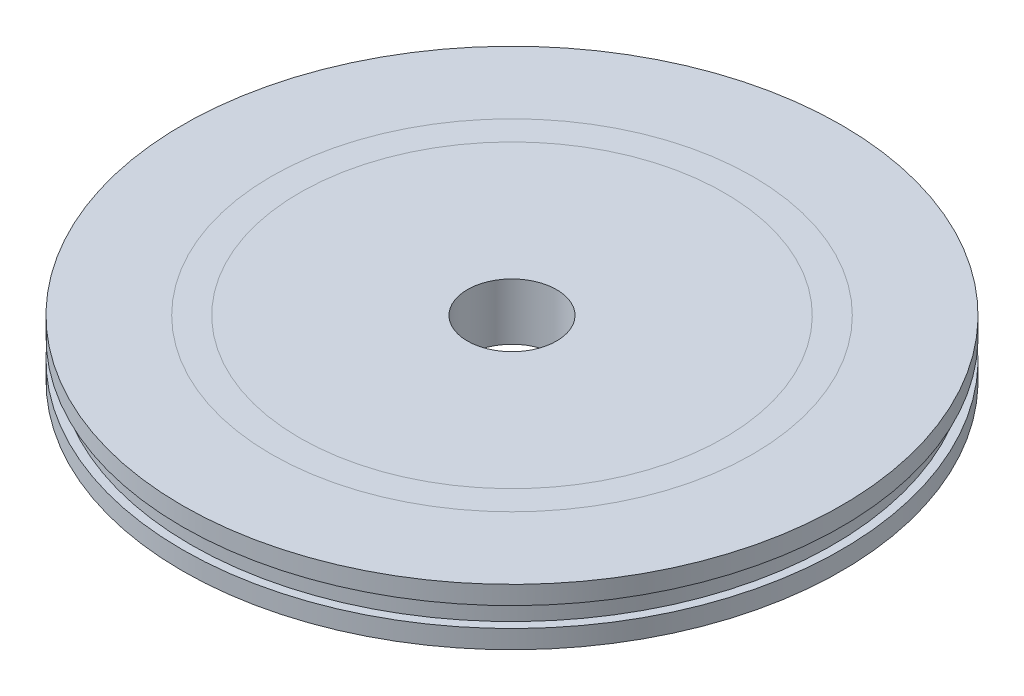
ISO-10303-21;
HEADER;
FILE_DESCRIPTION(('STEP AP214'),'2;1');
FILE_NAME('part.step','',(''),(''),'','','');
FILE_SCHEMA(('AUTOMOTIVE_DESIGN { 1 0 10303 214 1 1 1 1 }'));
ENDSEC;
DATA;
#1=APPLICATION_CONTEXT('core data for automotive mechanical design processes');
#2=APPLICATION_PROTOCOL_DEFINITION('international standard','automotive_design',2000,#1);
#3=PRODUCT_CONTEXT('',#1,'mechanical');
#4=PRODUCT('Part','Part','',(#3));
#5=PRODUCT_RELATED_PRODUCT_CATEGORY('part','',(#4));
#6=PRODUCT_DEFINITION_FORMATION('','',#4);
#7=PRODUCT_DEFINITION_CONTEXT('part definition',#1,'design');
#8=PRODUCT_DEFINITION('design','',#6,#7);
#9=PRODUCT_DEFINITION_SHAPE('','',#8);
#10=(LENGTH_UNIT() NAMED_UNIT(*) SI_UNIT(.MILLI.,.METRE.));
#11=(NAMED_UNIT(*) PLANE_ANGLE_UNIT() SI_UNIT($,.RADIAN.));
#12=(NAMED_UNIT(*) SI_UNIT($,.STERADIAN.) SOLID_ANGLE_UNIT());
#13=UNCERTAINTY_MEASURE_WITH_UNIT(LENGTH_MEASURE(1.E-05),#10,'distance_accuracy_value','');
#14=(GEOMETRIC_REPRESENTATION_CONTEXT(3) GLOBAL_UNCERTAINTY_ASSIGNED_CONTEXT((#13)) GLOBAL_UNIT_ASSIGNED_CONTEXT((#10,
#11,#12)) REPRESENTATION_CONTEXT('',''));
#15=CARTESIAN_POINT('',(0.,0.,0.));
#16=DIRECTION('',(0.,0.,1.));
#17=DIRECTION('',(1.,0.,0.));
#18=AXIS2_PLACEMENT_3D('',#15,#16,#17);
#19=CARTESIAN_POINT('',(0.,-5.08,0.));
#20=DIRECTION('',(0.,-1.,0.));
#21=DIRECTION('',(0.,0.,-1.));
#22=AXIS2_PLACEMENT_3D('',#19,#20,#21);
#23=PLANE('',#22);
#24=CARTESIAN_POINT('',(0.,-5.08,0.));
#25=DIRECTION('',(0.,1.,0.));
#26=DIRECTION('',(0.,0.,1.));
#27=AXIS2_PLACEMENT_3D('',#24,#25,#26);
#28=CIRCLE('',#27,29.5656);
#29=CARTESIAN_POINT('',(0.,-5.08,29.5656));
#30=VERTEX_POINT('',#29);
#31=EDGE_CURVE('E55',#30,#30,#28,.T.);
#32=ORIENTED_EDGE('',*,*,#31,.F.);
#33=EDGE_LOOP('',(#32));
#34=FACE_BOUND('',#33,.T.);
#35=CARTESIAN_POINT('',(0.,-5.08,0.));
#36=DIRECTION('',(0.,1.,0.));
#37=DIRECTION('',(0.,0.,1.));
#38=AXIS2_PLACEMENT_3D('',#35,#36,#37);
#39=CIRCLE('',#38,4.);
#40=CARTESIAN_POINT('',(0.,-5.08,4.));
#41=VERTEX_POINT('',#40);
#42=EDGE_CURVE('E83',#41,#41,#39,.T.);
#43=ORIENTED_EDGE('',*,*,#42,.T.);
#44=EDGE_LOOP('',(#43));
#45=FACE_BOUND('',#44,.T.);
#46=ADVANCED_FACE('F41',(#34,#45),#23,.T.);
#47=CARTESIAN_POINT('',(0.,0.,29.5656));
#48=DIRECTION('',(0.,1.,0.));
#49=DIRECTION('',(0.,0.,1.));
#50=AXIS2_PLACEMENT_3D('',#47,#48,#49);
#51=PLANE('',#50);
#52=CARTESIAN_POINT('',(0.,0.,0.));
#53=DIRECTION('',(0.,1.,0.));
#54=DIRECTION('',(0.,0.,1.));
#55=AXIS2_PLACEMENT_3D('',#52,#53,#54);
#56=CIRCLE('',#55,29.5656);
#57=CARTESIAN_POINT('',(0.,0.,29.5656));
#58=VERTEX_POINT('',#57);
#59=EDGE_CURVE('E79',#58,#58,#56,.T.);
#60=ORIENTED_EDGE('',*,*,#59,.T.);
#61=EDGE_LOOP('',(#60));
#62=FACE_BOUND('',#61,.T.);
#63=CARTESIAN_POINT('',(0.,0.,0.));
#64=DIRECTION('',(0.,1.,0.));
#65=DIRECTION('',(0.,0.,1.));
#66=AXIS2_PLACEMENT_3D('',#63,#64,#65);
#67=CIRCLE('',#66,21.59);
#68=CARTESIAN_POINT('',(0.,0.,21.59));
#69=VERTEX_POINT('',#68);
#70=EDGE_CURVE('E10',#69,#69,#67,.F.);
#71=ORIENTED_EDGE('',*,*,#70,.T.);
#72=EDGE_LOOP('',(#71));
#73=FACE_BOUND('',#72,.T.);
#74=ADVANCED_FACE('F98',(#62,#73),#51,.T.);
#75=ORIENTED_EDGE('',*,*,#70,.F.);
#76=EDGE_LOOP('',(#75));
#77=FACE_BOUND('',#76,.T.);
#78=CARTESIAN_POINT('',(0.,0.,0.));
#79=DIRECTION('',(0.,1.,0.));
#80=DIRECTION('',(0.,0.,1.));
#81=AXIS2_PLACEMENT_3D('',#78,#79,#80);
#82=CIRCLE('',#81,19.05);
#83=CARTESIAN_POINT('',(0.,0.,19.05));
#84=VERTEX_POINT('',#83);
#85=EDGE_CURVE('E49',#84,#84,#82,.F.);
#86=ORIENTED_EDGE('',*,*,#85,.T.);
#87=EDGE_LOOP('',(#86));
#88=FACE_BOUND('',#87,.T.);
#89=ADVANCED_FACE('F97',(#77,#88),#51,.T.);
#90=CARTESIAN_POINT('',(0.,0.,0.));
#91=DIRECTION('',(0.,1.,0.));
#92=DIRECTION('',(0.,0.,1.));
#93=AXIS2_PLACEMENT_3D('',#90,#91,#92);
#94=CIRCLE('',#93,4.);
#95=CARTESIAN_POINT('',(0.,0.,4.));
#96=VERTEX_POINT('',#95);
#97=EDGE_CURVE('E87',#96,#96,#94,.T.);
#98=ORIENTED_EDGE('',*,*,#97,.F.);
#99=EDGE_LOOP('',(#98));
#100=FACE_BOUND('',#99,.T.);
#101=ORIENTED_EDGE('',*,*,#85,.F.);
#102=EDGE_LOOP('',(#101));
#103=FACE_BOUND('',#102,.T.);
#104=ADVANCED_FACE('F43',(#100,#103),#51,.T.);
#105=CARTESIAN_POINT('',(0.,0.,0.));
#106=DIRECTION('',(0.,1.,0.));
#107=DIRECTION('',(0.,0.,1.));
#108=AXIS2_PLACEMENT_3D('',#105,#106,#107);
#109=CYLINDRICAL_SURFACE('',#108,29.5656);
#110=ORIENTED_EDGE('',*,*,#31,.T.);
#111=EDGE_LOOP('',(#110));
#112=FACE_BOUND('',#111,.T.);
#113=CARTESIAN_POINT('',(0.,-3.429,0.));
#114=DIRECTION('',(0.,1.,0.));
#115=DIRECTION('',(0.,0.,1.));
#116=AXIS2_PLACEMENT_3D('',#113,#114,#115);
#117=CIRCLE('',#116,29.5656);
#118=CARTESIAN_POINT('',(0.,-3.429,29.5656));
#119=VERTEX_POINT('',#118);
#120=EDGE_CURVE('E61',#119,#119,#117,.T.);
#121=ORIENTED_EDGE('',*,*,#120,.F.);
#122=EDGE_LOOP('',(#121));
#123=FACE_BOUND('',#122,.T.);
#124=ADVANCED_FACE('F96',(#112,#123),#109,.T.);
#125=CARTESIAN_POINT('',(0.,-3.429,29.5656));
#126=DIRECTION('',(0.,1.,0.));
#127=DIRECTION('',(0.,0.,1.));
#128=AXIS2_PLACEMENT_3D('',#125,#126,#127);
#129=PLANE('',#128);
#130=ORIENTED_EDGE('',*,*,#120,.T.);
#131=EDGE_LOOP('',(#130));
#132=FACE_BOUND('',#131,.T.);
#133=CARTESIAN_POINT('',(0.,-3.429,0.));
#134=DIRECTION('',(0.,1.,0.));
#135=DIRECTION('',(0.,0.,1.));
#136=AXIS2_PLACEMENT_3D('',#133,#134,#135);
#137=CIRCLE('',#136,28.8036);
#138=CARTESIAN_POINT('',(0.,-3.429,28.8036));
#139=VERTEX_POINT('',#138);
#140=EDGE_CURVE('E67',#139,#139,#137,.T.);
#141=ORIENTED_EDGE('',*,*,#140,.F.);
#142=EDGE_LOOP('',(#141));
#143=FACE_BOUND('',#142,.T.);
#144=ADVANCED_FACE('F103',(#132,#143),#129,.T.);
#145=CARTESIAN_POINT('',(0.,0.,0.));
#146=DIRECTION('',(0.,1.,0.));
#147=DIRECTION('',(0.,0.,1.));
#148=AXIS2_PLACEMENT_3D('',#145,#146,#147);
#149=CYLINDRICAL_SURFACE('',#148,28.8036);
#150=ORIENTED_EDGE('',*,*,#140,.T.);
#151=EDGE_LOOP('',(#150));
#152=FACE_BOUND('',#151,.T.);
#153=CARTESIAN_POINT('',(0.,-1.651,0.));
#154=DIRECTION('',(0.,1.,0.));
#155=DIRECTION('',(0.,0.,1.));
#156=AXIS2_PLACEMENT_3D('',#153,#154,#155);
#157=CIRCLE('',#156,28.8036);
#158=CARTESIAN_POINT('',(0.,-1.651,28.8036));
#159=VERTEX_POINT('',#158);
#160=EDGE_CURVE('E71',#159,#159,#157,.T.);
#161=ORIENTED_EDGE('',*,*,#160,.F.);
#162=EDGE_LOOP('',(#161));
#163=FACE_BOUND('',#162,.T.);
#164=ADVANCED_FACE('F118',(#152,#163),#149,.T.);
#165=CARTESIAN_POINT('',(0.,-1.651,28.8036));
#166=DIRECTION('',(0.,-1.,0.));
#167=DIRECTION('',(0.,0.,-1.));
#168=AXIS2_PLACEMENT_3D('',#165,#166,#167);
#169=PLANE('',#168);
#170=ORIENTED_EDGE('',*,*,#160,.T.);
#171=EDGE_LOOP('',(#170));
#172=FACE_BOUND('',#171,.T.);
#173=CARTESIAN_POINT('',(0.,-1.651,0.));
#174=DIRECTION('',(0.,1.,0.));
#175=DIRECTION('',(0.,0.,1.));
#176=AXIS2_PLACEMENT_3D('',#173,#174,#175);
#177=CIRCLE('',#176,29.5656);
#178=CARTESIAN_POINT('',(0.,-1.651,29.5656));
#179=VERTEX_POINT('',#178);
#180=EDGE_CURVE('E75',#179,#179,#177,.T.);
#181=ORIENTED_EDGE('',*,*,#180,.F.);
#182=EDGE_LOOP('',(#181));
#183=FACE_BOUND('',#182,.T.);
#184=ADVANCED_FACE('F122',(#172,#183),#169,.T.);
#185=CARTESIAN_POINT('',(0.,0.,0.));
#186=DIRECTION('',(0.,1.,0.));
#187=DIRECTION('',(0.,0.,1.));
#188=AXIS2_PLACEMENT_3D('',#185,#186,#187);
#189=CYLINDRICAL_SURFACE('',#188,29.5656);
#190=ORIENTED_EDGE('',*,*,#180,.T.);
#191=EDGE_LOOP('',(#190));
#192=FACE_BOUND('',#191,.T.);
#193=ORIENTED_EDGE('',*,*,#59,.F.);
#194=EDGE_LOOP('',(#193));
#195=FACE_BOUND('',#194,.T.);
#196=ADVANCED_FACE('F126',(#192,#195),#189,.T.);
#197=CARTESIAN_POINT('',(0.,0.,0.));
#198=DIRECTION('',(0.,1.,0.));
#199=DIRECTION('',(0.,0.,1.));
#200=AXIS2_PLACEMENT_3D('',#197,#198,#199);
#201=CYLINDRICAL_SURFACE('',#200,4.);
#202=ORIENTED_EDGE('',*,*,#42,.F.);
#203=EDGE_LOOP('',(#202));
#204=FACE_BOUND('',#203,.T.);
#205=ORIENTED_EDGE('',*,*,#97,.T.);
#206=EDGE_LOOP('',(#205));
#207=FACE_BOUND('',#206,.T.);
#208=ADVANCED_FACE('F92',(#204,#207),#201,.F.);
#209=CLOSED_SHELL('',(#46,#74,#89,#104,#124,#144,#164,#184,#196,#208));
#210=MANIFOLD_SOLID_BREP('B2',#209);
#211=ADVANCED_BREP_SHAPE_REPRESENTATION('',(#18,#210),#14);
#212=SHAPE_DEFINITION_REPRESENTATION(#9,#211);
ENDSEC;
END-ISO-10303-21;
